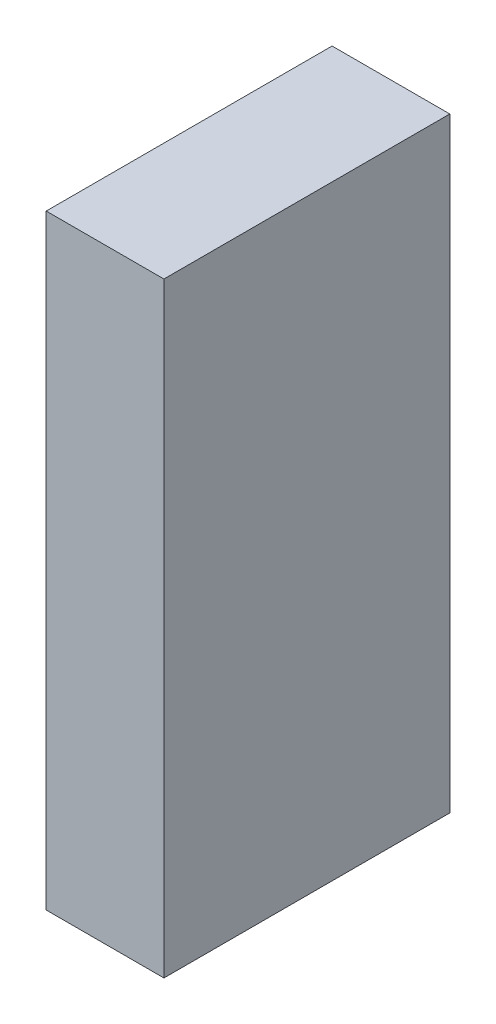
ISO-10303-21;
HEADER;
FILE_DESCRIPTION(('STEP AP214'),'2;1');
FILE_NAME('part.step','',(''),(''),'','','');
FILE_SCHEMA(('AUTOMOTIVE_DESIGN { 1 0 10303 214 1 1 1 1 }'));
ENDSEC;
DATA;
#1=APPLICATION_CONTEXT('core data for automotive mechanical design processes');
#2=APPLICATION_PROTOCOL_DEFINITION('international standard','automotive_design',2000,#1);
#3=PRODUCT_CONTEXT('',#1,'mechanical');
#4=PRODUCT('Part','Part','',(#3));
#5=PRODUCT_RELATED_PRODUCT_CATEGORY('part','',(#4));
#6=PRODUCT_DEFINITION_FORMATION('','',#4);
#7=PRODUCT_DEFINITION_CONTEXT('part definition',#1,'design');
#8=PRODUCT_DEFINITION('design','',#6,#7);
#9=PRODUCT_DEFINITION_SHAPE('','',#8);
#10=(LENGTH_UNIT() NAMED_UNIT(*) SI_UNIT(.MILLI.,.METRE.));
#11=(NAMED_UNIT(*) PLANE_ANGLE_UNIT() SI_UNIT($,.RADIAN.));
#12=(NAMED_UNIT(*) SI_UNIT($,.STERADIAN.) SOLID_ANGLE_UNIT());
#13=UNCERTAINTY_MEASURE_WITH_UNIT(LENGTH_MEASURE(1.E-05),#10,'distance_accuracy_value','');
#14=(GEOMETRIC_REPRESENTATION_CONTEXT(3) GLOBAL_UNCERTAINTY_ASSIGNED_CONTEXT((#13)) GLOBAL_UNIT_ASSIGNED_CONTEXT((#10,
#11,#12)) REPRESENTATION_CONTEXT('',''));
#15=CARTESIAN_POINT('',(0.,0.,0.));
#16=DIRECTION('',(0.,0.,1.));
#17=DIRECTION('',(1.,0.,0.));
#18=AXIS2_PLACEMENT_3D('',#15,#16,#17);
#19=CARTESIAN_POINT('',(-6.06691449814128,72.,9.03717472118959));
#20=DIRECTION('',(1.,0.,0.));
#21=DIRECTION('',(0.,0.,-1.));
#22=AXIS2_PLACEMENT_3D('',#19,#20,#21);
#23=PLANE('',#22);
#24=DIRECTION('',(0.,0.,1.));
#25=VECTOR('',#24,1.);
#26=CARTESIAN_POINT('',(-6.06691449814128,0.,9.03717472118959));
#27=LINE('',#26,#25);
#28=CARTESIAN_POINT('',(-6.06691449814128,0.,-24.9628252788104));
#29=VERTEX_POINT('',#28);
#30=CARTESIAN_POINT('',(-6.06691449814128,0.,9.03717472118959));
#31=VERTEX_POINT('',#30);
#32=EDGE_CURVE('E96',#29,#31,#27,.T.);
#33=ORIENTED_EDGE('',*,*,#32,.T.);
#34=DIRECTION('',(0.,-1.,0.));
#35=VECTOR('',#34,1.);
#36=CARTESIAN_POINT('',(-6.06691449814128,72.,9.03717472118959));
#37=LINE('',#36,#35);
#38=CARTESIAN_POINT('',(-6.06691449814128,72.,9.03717472118959));
#39=VERTEX_POINT('',#38);
#40=EDGE_CURVE('E11',#39,#31,#37,.T.);
#41=ORIENTED_EDGE('',*,*,#40,.F.);
#42=DIRECTION('',(0.,0.,1.));
#43=VECTOR('',#42,1.);
#44=CARTESIAN_POINT('',(-6.06691449814128,72.,9.03717472118959));
#45=LINE('',#44,#43);
#46=CARTESIAN_POINT('',(-6.06691449814128,72.,-24.9628252788104));
#47=VERTEX_POINT('',#46);
#48=EDGE_CURVE('E84',#47,#39,#45,.T.);
#49=ORIENTED_EDGE('',*,*,#48,.F.);
#50=DIRECTION('',(0.,-1.,0.));
#51=VECTOR('',#50,1.);
#52=CARTESIAN_POINT('',(-6.06691449814128,72.,-24.9628252788104));
#53=LINE('',#52,#51);
#54=EDGE_CURVE('E92',#47,#29,#53,.T.);
#55=ORIENTED_EDGE('',*,*,#54,.T.);
#56=EDGE_LOOP('',(#33,#41,#49,#55));
#57=FACE_BOUND('',#56,.T.);
#58=ADVANCED_FACE('F33',(#57),#23,.F.);
#59=CARTESIAN_POINT('',(-6.06691449814128,72.,9.03717472118959));
#60=DIRECTION('',(0.,0.,-1.));
#61=DIRECTION('',(-1.,0.,0.));
#62=AXIS2_PLACEMENT_3D('',#59,#60,#61);
#63=PLANE('',#62);
#64=DIRECTION('',(1.,0.,0.));
#65=VECTOR('',#64,1.);
#66=CARTESIAN_POINT('',(-6.06691449814128,0.,9.03717472118959));
#67=LINE('',#66,#65);
#68=CARTESIAN_POINT('',(7.93308550185872,0.,9.03717472118959));
#69=VERTEX_POINT('',#68);
#70=EDGE_CURVE('E88',#31,#69,#67,.T.);
#71=ORIENTED_EDGE('',*,*,#70,.T.);
#72=DIRECTION('',(0.,-1.,0.));
#73=VECTOR('',#72,1.);
#74=CARTESIAN_POINT('',(7.93308550185872,72.,9.03717472118959));
#75=LINE('',#74,#73);
#76=CARTESIAN_POINT('',(7.93308550185872,72.,9.03717472118959));
#77=VERTEX_POINT('',#76);
#78=EDGE_CURVE('E41',#77,#69,#75,.T.);
#79=ORIENTED_EDGE('',*,*,#78,.F.);
#80=DIRECTION('',(1.,0.,0.));
#81=VECTOR('',#80,1.);
#82=CARTESIAN_POINT('',(-6.06691449814128,72.,9.03717472118959));
#83=LINE('',#82,#81);
#84=EDGE_CURVE('E79',#39,#77,#83,.T.);
#85=ORIENTED_EDGE('',*,*,#84,.F.);
#86=ORIENTED_EDGE('',*,*,#40,.T.);
#87=EDGE_LOOP('',(#71,#79,#85,#86));
#88=FACE_BOUND('',#87,.T.);
#89=ADVANCED_FACE('F87',(#88),#63,.F.);
#90=CARTESIAN_POINT('',(7.93308550185872,72.,9.03717472118959));
#91=DIRECTION('',(-1.,0.,0.));
#92=DIRECTION('',(0.,0.,1.));
#93=AXIS2_PLACEMENT_3D('',#90,#91,#92);
#94=PLANE('',#93);
#95=DIRECTION('',(0.,0.,-1.));
#96=VECTOR('',#95,1.);
#97=CARTESIAN_POINT('',(7.93308550185872,0.,9.03717472118959));
#98=LINE('',#97,#96);
#99=CARTESIAN_POINT('',(7.93308550185872,0.,-24.9628252788104));
#100=VERTEX_POINT('',#99);
#101=EDGE_CURVE('E66',#69,#100,#98,.T.);
#102=ORIENTED_EDGE('',*,*,#101,.T.);
#103=DIRECTION('',(0.,-1.,0.));
#104=VECTOR('',#103,1.);
#105=CARTESIAN_POINT('',(7.93308550185872,72.,-24.9628252788104));
#106=LINE('',#105,#104);
#107=CARTESIAN_POINT('',(7.93308550185872,72.,-24.9628252788104));
#108=VERTEX_POINT('',#107);
#109=EDGE_CURVE('E89',#108,#100,#106,.T.);
#110=ORIENTED_EDGE('',*,*,#109,.F.);
#111=DIRECTION('',(0.,0.,-1.));
#112=VECTOR('',#111,1.);
#113=CARTESIAN_POINT('',(7.93308550185872,72.,9.03717472118959));
#114=LINE('',#113,#112);
#115=EDGE_CURVE('E82',#77,#108,#114,.T.);
#116=ORIENTED_EDGE('',*,*,#115,.F.);
#117=ORIENTED_EDGE('',*,*,#78,.T.);
#118=EDGE_LOOP('',(#102,#110,#116,#117));
#119=FACE_BOUND('',#118,.T.);
#120=ADVANCED_FACE('F90',(#119),#94,.F.);
#121=CARTESIAN_POINT('',(-6.06691449814128,72.,-24.9628252788104));
#122=DIRECTION('',(0.,0.,1.));
#123=DIRECTION('',(1.,0.,0.));
#124=AXIS2_PLACEMENT_3D('',#121,#122,#123);
#125=PLANE('',#124);
#126=DIRECTION('',(-1.,0.,0.));
#127=VECTOR('',#126,1.);
#128=CARTESIAN_POINT('',(-6.06691449814128,0.,-24.9628252788104));
#129=LINE('',#128,#127);
#130=EDGE_CURVE('E72',#100,#29,#129,.T.);
#131=ORIENTED_EDGE('',*,*,#130,.T.);
#132=ORIENTED_EDGE('',*,*,#54,.F.);
#133=DIRECTION('',(-1.,0.,0.));
#134=VECTOR('',#133,1.);
#135=CARTESIAN_POINT('',(-6.06691449814128,72.,-24.9628252788104));
#136=LINE('',#135,#134);
#137=EDGE_CURVE('E49',#108,#47,#136,.T.);
#138=ORIENTED_EDGE('',*,*,#137,.F.);
#139=ORIENTED_EDGE('',*,*,#109,.T.);
#140=EDGE_LOOP('',(#131,#132,#138,#139));
#141=FACE_BOUND('',#140,.T.);
#142=ADVANCED_FACE('F103',(#141),#125,.F.);
#143=CARTESIAN_POINT('',(0.,72.,0.));
#144=DIRECTION('',(0.,-1.,0.));
#145=DIRECTION('',(0.,0.,-1.));
#146=AXIS2_PLACEMENT_3D('',#143,#144,#145);
#147=PLANE('',#146);
#148=ORIENTED_EDGE('',*,*,#48,.T.);
#149=ORIENTED_EDGE('',*,*,#84,.T.);
#150=ORIENTED_EDGE('',*,*,#115,.T.);
#151=ORIENTED_EDGE('',*,*,#137,.T.);
#152=EDGE_LOOP('',(#148,#149,#150,#151));
#153=FACE_BOUND('',#152,.T.);
#154=ADVANCED_FACE('F80',(#153),#147,.F.);
#155=CARTESIAN_POINT('',(0.,0.,0.));
#156=DIRECTION('',(0.,-1.,0.));
#157=DIRECTION('',(0.,0.,-1.));
#158=AXIS2_PLACEMENT_3D('',#155,#156,#157);
#159=PLANE('',#158);
#160=ORIENTED_EDGE('',*,*,#32,.F.);
#161=ORIENTED_EDGE('',*,*,#130,.F.);
#162=ORIENTED_EDGE('',*,*,#101,.F.);
#163=ORIENTED_EDGE('',*,*,#70,.F.);
#164=EDGE_LOOP('',(#160,#161,#162,#163));
#165=FACE_BOUND('',#164,.T.);
#166=ADVANCED_FACE('F106',(#165),#159,.T.);
#167=CLOSED_SHELL('',(#58,#89,#120,#142,#154,#166));
#168=MANIFOLD_SOLID_BREP('B2',#167);
#169=ADVANCED_BREP_SHAPE_REPRESENTATION('',(#18,#168),#14);
#170=SHAPE_DEFINITION_REPRESENTATION(#9,#169);
ENDSEC;
END-ISO-10303-21;
